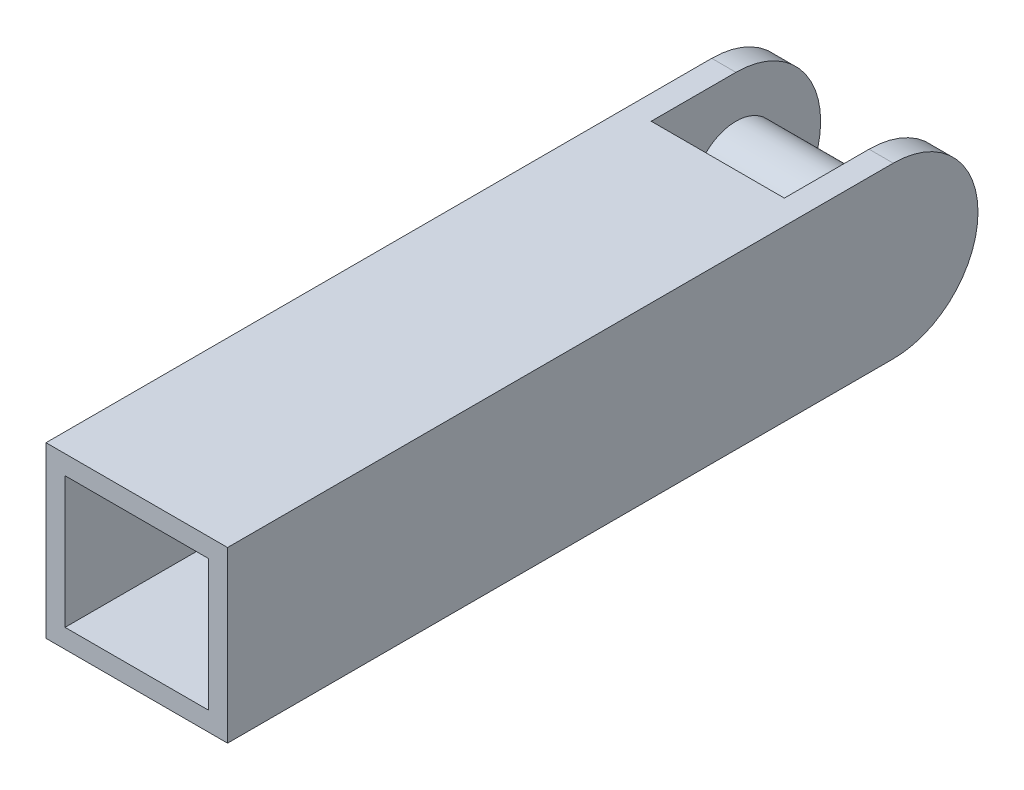
ISO-10303-21;
HEADER;
FILE_DESCRIPTION(('STEP AP214'),'2;1');
FILE_NAME('part.step','',(''),(''),'','','');
FILE_SCHEMA(('AUTOMOTIVE_DESIGN { 1 0 10303 214 1 1 1 1 }'));
ENDSEC;
DATA;
#1=APPLICATION_CONTEXT('core data for automotive mechanical design processes');
#2=APPLICATION_PROTOCOL_DEFINITION('international standard','automotive_design',2000,#1);
#3=PRODUCT_CONTEXT('',#1,'mechanical');
#4=PRODUCT('Part','Part','',(#3));
#5=PRODUCT_RELATED_PRODUCT_CATEGORY('part','',(#4));
#6=PRODUCT_DEFINITION_FORMATION('','',#4);
#7=PRODUCT_DEFINITION_CONTEXT('part definition',#1,'design');
#8=PRODUCT_DEFINITION('design','',#6,#7);
#9=PRODUCT_DEFINITION_SHAPE('','',#8);
#10=(LENGTH_UNIT() NAMED_UNIT(*) SI_UNIT(.MILLI.,.METRE.));
#11=(NAMED_UNIT(*) PLANE_ANGLE_UNIT() SI_UNIT($,.RADIAN.));
#12=(NAMED_UNIT(*) SI_UNIT($,.STERADIAN.) SOLID_ANGLE_UNIT());
#13=UNCERTAINTY_MEASURE_WITH_UNIT(LENGTH_MEASURE(1.E-05),#10,'distance_accuracy_value','');
#14=(GEOMETRIC_REPRESENTATION_CONTEXT(3) GLOBAL_UNCERTAINTY_ASSIGNED_CONTEXT((#13)) GLOBAL_UNIT_ASSIGNED_CONTEXT((#10,
#11,#12)) REPRESENTATION_CONTEXT('',''));
#15=CARTESIAN_POINT('',(0.,0.,0.));
#16=DIRECTION('',(0.,0.,1.));
#17=DIRECTION('',(1.,0.,0.));
#18=AXIS2_PLACEMENT_3D('',#15,#16,#17);
#19=CARTESIAN_POINT('',(34.925,0.,0.));
#20=DIRECTION('',(-1.,0.,0.));
#21=DIRECTION('',(0.,0.,1.));
#22=AXIS2_PLACEMENT_3D('',#19,#20,#21);
#23=CYLINDRICAL_SURFACE('',#22,22.225);
#24=CARTESIAN_POINT('',(34.925,0.,0.));
#25=DIRECTION('',(1.,0.,0.));
#26=DIRECTION('',(0.,0.,-1.));
#27=AXIS2_PLACEMENT_3D('',#24,#25,#26);
#28=CIRCLE('',#27,22.225);
#29=CARTESIAN_POINT('',(34.925,0.,-22.225));
#30=VERTEX_POINT('',#29);
#31=EDGE_CURVE('E11',#30,#30,#28,.T.);
#32=ORIENTED_EDGE('',*,*,#31,.F.);
#33=EDGE_LOOP('',(#32));
#34=FACE_BOUND('',#33,.T.);
#35=CARTESIAN_POINT('',(-34.925,0.,0.));
#36=DIRECTION('',(1.,0.,0.));
#37=DIRECTION('',(0.,0.,-1.));
#38=AXIS2_PLACEMENT_3D('',#35,#36,#37);
#39=CIRCLE('',#38,22.225);
#40=CARTESIAN_POINT('',(-34.925,0.,-22.225));
#41=VERTEX_POINT('',#40);
#42=EDGE_CURVE('E50',#41,#41,#39,.T.);
#43=ORIENTED_EDGE('',*,*,#42,.T.);
#44=EDGE_LOOP('',(#43));
#45=FACE_BOUND('',#44,.T.);
#46=ADVANCED_FACE('F42',(#34,#45),#23,.T.);
#47=CARTESIAN_POINT('',(-47.625,44.45,0.));
#48=DIRECTION('',(0.,1.,0.));
#49=DIRECTION('',(0.,0.,1.));
#50=AXIS2_PLACEMENT_3D('',#47,#48,#49);
#51=PLANE('',#50);
#52=DIRECTION('',(0.,0.,1.));
#53=VECTOR('',#52,1.);
#54=CARTESIAN_POINT('',(-34.925,44.45,0.));
#55=LINE('',#54,#53);
#56=CARTESIAN_POINT('',(-34.925,44.45,0.));
#57=VERTEX_POINT('',#56);
#58=CARTESIAN_POINT('',(-34.925,44.45,44.45));
#59=VERTEX_POINT('',#58);
#60=EDGE_CURVE('E91',#57,#59,#55,.T.);
#61=ORIENTED_EDGE('',*,*,#60,.F.);
#62=DIRECTION('',(1.,0.,0.));
#63=VECTOR('',#62,1.);
#64=CARTESIAN_POINT('',(-47.625,44.45,0.));
#65=LINE('',#64,#63);
#66=CARTESIAN_POINT('',(-47.625,44.45,0.));
#67=VERTEX_POINT('',#66);
#68=EDGE_CURVE('E70',#67,#57,#65,.T.);
#69=ORIENTED_EDGE('',*,*,#68,.F.);
#70=DIRECTION('',(0.,0.,1.));
#71=VECTOR('',#70,1.);
#72=CARTESIAN_POINT('',(-47.625,44.45,0.));
#73=LINE('',#72,#71);
#74=CARTESIAN_POINT('',(-47.625,44.45,349.25));
#75=VERTEX_POINT('',#74);
#76=EDGE_CURVE('E109',#67,#75,#73,.T.);
#77=ORIENTED_EDGE('',*,*,#76,.T.);
#78=DIRECTION('',(1.,0.,0.));
#79=VECTOR('',#78,1.);
#80=CARTESIAN_POINT('',(-365.125,44.45,349.25));
#81=LINE('',#80,#79);
#82=CARTESIAN_POINT('',(47.625,44.45,349.25));
#83=VERTEX_POINT('',#82);
#84=EDGE_CURVE('E245',#75,#83,#81,.T.);
#85=ORIENTED_EDGE('',*,*,#84,.T.);
#86=DIRECTION('',(0.,0.,1.));
#87=VECTOR('',#86,1.);
#88=CARTESIAN_POINT('',(47.625,44.45,0.));
#89=LINE('',#88,#87);
#90=CARTESIAN_POINT('',(47.625,44.45,0.));
#91=VERTEX_POINT('',#90);
#92=EDGE_CURVE('E223',#91,#83,#89,.T.);
#93=ORIENTED_EDGE('',*,*,#92,.F.);
#94=DIRECTION('',(-1.,0.,0.));
#95=VECTOR('',#94,1.);
#96=CARTESIAN_POINT('',(47.625,44.45,0.));
#97=LINE('',#96,#95);
#98=CARTESIAN_POINT('',(34.925,44.45,0.));
#99=VERTEX_POINT('',#98);
#100=EDGE_CURVE('E234',#91,#99,#97,.T.);
#101=ORIENTED_EDGE('',*,*,#100,.T.);
#102=DIRECTION('',(0.,0.,1.));
#103=VECTOR('',#102,1.);
#104=CARTESIAN_POINT('',(34.925,44.45,0.));
#105=LINE('',#104,#103);
#106=CARTESIAN_POINT('',(34.925,44.45,44.45));
#107=VERTEX_POINT('',#106);
#108=EDGE_CURVE('E222',#99,#107,#105,.T.);
#109=ORIENTED_EDGE('',*,*,#108,.T.);
#110=DIRECTION('',(1.,0.,0.));
#111=VECTOR('',#110,1.);
#112=CARTESIAN_POINT('',(-365.125,44.45,44.45));
#113=LINE('',#112,#111);
#114=EDGE_CURVE('E101',#59,#107,#113,.T.);
#115=ORIENTED_EDGE('',*,*,#114,.F.);
#116=EDGE_LOOP('',(#61,#69,#77,#85,#93,#101,#109,#115));
#117=FACE_BOUND('',#116,.T.);
#118=ADVANCED_FACE('F99',(#117),#51,.T.);
#119=CARTESIAN_POINT('',(-47.625,0.,0.));
#120=DIRECTION('',(1.,0.,0.));
#121=DIRECTION('',(0.,0.,-1.));
#122=AXIS2_PLACEMENT_3D('',#119,#120,#121);
#123=CYLINDRICAL_SURFACE('',#122,44.45);
#124=CARTESIAN_POINT('',(-34.925,0.,0.));
#125=DIRECTION('',(1.,0.,0.));
#126=DIRECTION('',(0.,0.,-1.));
#127=AXIS2_PLACEMENT_3D('',#124,#125,#126);
#128=CIRCLE('',#127,44.45);
#129=CARTESIAN_POINT('',(-34.925,-44.45,0.));
#130=VERTEX_POINT('',#129);
#131=EDGE_CURVE('E81',#130,#57,#128,.T.);
#132=ORIENTED_EDGE('',*,*,#131,.F.);
#133=DIRECTION('',(1.,0.,0.));
#134=VECTOR('',#133,1.);
#135=CARTESIAN_POINT('',(-47.625,-44.45,0.));
#136=LINE('',#135,#134);
#137=CARTESIAN_POINT('',(-47.625,-44.45,0.));
#138=VERTEX_POINT('',#137);
#139=EDGE_CURVE('E90',#138,#130,#136,.T.);
#140=ORIENTED_EDGE('',*,*,#139,.F.);
#141=CARTESIAN_POINT('',(-47.625,0.,0.));
#142=DIRECTION('',(1.,0.,0.));
#143=DIRECTION('',(0.,0.,-1.));
#144=AXIS2_PLACEMENT_3D('',#141,#142,#143);
#145=CIRCLE('',#144,44.45);
#146=EDGE_CURVE('E89',#138,#67,#145,.T.);
#147=ORIENTED_EDGE('',*,*,#146,.T.);
#148=ORIENTED_EDGE('',*,*,#68,.T.);
#149=EDGE_LOOP('',(#132,#140,#147,#148));
#150=FACE_BOUND('',#149,.T.);
#151=ADVANCED_FACE('F84',(#150),#123,.T.);
#152=CARTESIAN_POINT('',(-47.625,-44.45,0.));
#153=DIRECTION('',(0.,1.,0.));
#154=DIRECTION('',(0.,0.,1.));
#155=AXIS2_PLACEMENT_3D('',#152,#153,#154);
#156=PLANE('',#155);
#157=DIRECTION('',(0.,0.,1.));
#158=VECTOR('',#157,1.);
#159=CARTESIAN_POINT('',(-34.925,-44.45,0.));
#160=LINE('',#159,#158);
#161=CARTESIAN_POINT('',(-34.925,-44.45,44.45));
#162=VERTEX_POINT('',#161);
#163=EDGE_CURVE('E97',#130,#162,#160,.T.);
#164=ORIENTED_EDGE('',*,*,#163,.T.);
#165=DIRECTION('',(1.,0.,0.));
#166=VECTOR('',#165,1.);
#167=CARTESIAN_POINT('',(-365.125,-44.45,44.45));
#168=LINE('',#167,#166);
#169=CARTESIAN_POINT('',(34.925,-44.45,44.45));
#170=VERTEX_POINT('',#169);
#171=EDGE_CURVE('E123',#162,#170,#168,.T.);
#172=ORIENTED_EDGE('',*,*,#171,.T.);
#173=DIRECTION('',(0.,0.,1.));
#174=VECTOR('',#173,1.);
#175=CARTESIAN_POINT('',(34.925,-44.45,0.));
#176=LINE('',#175,#174);
#177=CARTESIAN_POINT('',(34.925,-44.45,0.));
#178=VERTEX_POINT('',#177);
#179=EDGE_CURVE('E226',#178,#170,#176,.T.);
#180=ORIENTED_EDGE('',*,*,#179,.F.);
#181=DIRECTION('',(-1.,0.,0.));
#182=VECTOR('',#181,1.);
#183=CARTESIAN_POINT('',(47.625,-44.45,0.));
#184=LINE('',#183,#182);
#185=CARTESIAN_POINT('',(47.625,-44.45,0.));
#186=VERTEX_POINT('',#185);
#187=EDGE_CURVE('E228',#186,#178,#184,.T.);
#188=ORIENTED_EDGE('',*,*,#187,.F.);
#189=DIRECTION('',(0.,0.,1.));
#190=VECTOR('',#189,1.);
#191=CARTESIAN_POINT('',(47.625,-44.45,0.));
#192=LINE('',#191,#190);
#193=CARTESIAN_POINT('',(47.625,-44.45,349.25));
#194=VERTEX_POINT('',#193);
#195=EDGE_CURVE('E216',#186,#194,#192,.T.);
#196=ORIENTED_EDGE('',*,*,#195,.T.);
#197=DIRECTION('',(1.,0.,0.));
#198=VECTOR('',#197,1.);
#199=CARTESIAN_POINT('',(-365.125,-44.45,349.25));
#200=LINE('',#199,#198);
#201=CARTESIAN_POINT('',(-47.625,-44.45,349.25));
#202=VERTEX_POINT('',#201);
#203=EDGE_CURVE('E240',#202,#194,#200,.T.);
#204=ORIENTED_EDGE('',*,*,#203,.F.);
#205=DIRECTION('',(0.,0.,1.));
#206=VECTOR('',#205,1.);
#207=CARTESIAN_POINT('',(-47.625,-44.45,0.));
#208=LINE('',#207,#206);
#209=EDGE_CURVE('E104',#138,#202,#208,.T.);
#210=ORIENTED_EDGE('',*,*,#209,.F.);
#211=ORIENTED_EDGE('',*,*,#139,.T.);
#212=EDGE_LOOP('',(#164,#172,#180,#188,#196,#204,#210,#211));
#213=FACE_BOUND('',#212,.T.);
#214=ADVANCED_FACE('F125',(#213),#156,.F.);
#215=CARTESIAN_POINT('',(-47.625,0.,0.));
#216=DIRECTION('',(1.,0.,0.));
#217=DIRECTION('',(0.,0.,-1.));
#218=AXIS2_PLACEMENT_3D('',#215,#216,#217);
#219=PLANE('',#218);
#220=ORIENTED_EDGE('',*,*,#209,.T.);
#221=DIRECTION('',(0.,-1.,0.));
#222=VECTOR('',#221,1.);
#223=CARTESIAN_POINT('',(-47.625,0.,349.25));
#224=LINE('',#223,#222);
#225=EDGE_CURVE('E119',#75,#202,#224,.T.);
#226=ORIENTED_EDGE('',*,*,#225,.F.);
#227=ORIENTED_EDGE('',*,*,#76,.F.);
#228=ORIENTED_EDGE('',*,*,#146,.F.);
#229=EDGE_LOOP('',(#220,#226,#227,#228));
#230=FACE_BOUND('',#229,.T.);
#231=ADVANCED_FACE('F288',(#230),#219,.F.);
#232=CARTESIAN_POINT('',(-34.925,0.,0.));
#233=DIRECTION('',(1.,0.,0.));
#234=DIRECTION('',(0.,0.,-1.));
#235=AXIS2_PLACEMENT_3D('',#232,#233,#234);
#236=PLANE('',#235);
#237=ORIENTED_EDGE('',*,*,#42,.F.);
#238=EDGE_LOOP('',(#237));
#239=FACE_BOUND('',#238,.T.);
#240=DIRECTION('',(0.,-1.,0.));
#241=VECTOR('',#240,1.);
#242=CARTESIAN_POINT('',(-34.925,0.,44.45));
#243=LINE('',#242,#241);
#244=EDGE_CURVE('E118',#59,#162,#243,.T.);
#245=ORIENTED_EDGE('',*,*,#244,.T.);
#246=ORIENTED_EDGE('',*,*,#163,.F.);
#247=ORIENTED_EDGE('',*,*,#131,.T.);
#248=ORIENTED_EDGE('',*,*,#60,.T.);
#249=EDGE_LOOP('',(#245,#246,#247,#248));
#250=FACE_BOUND('',#249,.T.);
#251=ADVANCED_FACE('F94',(#239,#250),#236,.T.);
#252=CARTESIAN_POINT('',(-365.125,0.,44.45));
#253=DIRECTION('',(0.,0.,1.));
#254=DIRECTION('',(0.,-1.,0.));
#255=AXIS2_PLACEMENT_3D('',#252,#253,#254);
#256=PLANE('',#255);
#257=ORIENTED_EDGE('',*,*,#244,.F.);
#258=ORIENTED_EDGE('',*,*,#114,.T.);
#259=DIRECTION('',(0.,-1.,0.));
#260=VECTOR('',#259,1.);
#261=CARTESIAN_POINT('',(34.925,0.,44.45));
#262=LINE('',#261,#260);
#263=EDGE_CURVE('E219',#107,#170,#262,.T.);
#264=ORIENTED_EDGE('',*,*,#263,.T.);
#265=ORIENTED_EDGE('',*,*,#171,.F.);
#266=EDGE_LOOP('',(#257,#258,#264,#265));
#267=FACE_BOUND('',#266,.T.);
#268=ADVANCED_FACE('F126',(#267),#256,.F.);
#269=CARTESIAN_POINT('',(-365.125,0.,349.25));
#270=DIRECTION('',(0.,0.,-1.));
#271=DIRECTION('',(-1.,0.,0.));
#272=AXIS2_PLACEMENT_3D('',#269,#270,#271);
#273=PLANE('',#272);
#274=DIRECTION('',(-1.,0.,0.));
#275=VECTOR('',#274,1.);
#276=CARTESIAN_POINT('',(37.625,34.45,349.25));
#277=LINE('',#276,#275);
#278=CARTESIAN_POINT('',(37.6250000000001,34.45,349.25));
#279=VERTEX_POINT('',#278);
#280=CARTESIAN_POINT('',(-37.625,34.45,349.25));
#281=VERTEX_POINT('',#280);
#282=EDGE_CURVE('E202',#279,#281,#277,.T.);
#283=ORIENTED_EDGE('',*,*,#282,.F.);
#284=DIRECTION('',(0.,1.,0.));
#285=VECTOR('',#284,1.);
#286=CARTESIAN_POINT('',(37.625,-34.45,349.25));
#287=LINE('',#286,#285);
#288=CARTESIAN_POINT('',(37.625,-34.45,349.25));
#289=VERTEX_POINT('',#288);
#290=EDGE_CURVE('E59',#289,#279,#287,.T.);
#291=ORIENTED_EDGE('',*,*,#290,.F.);
#292=DIRECTION('',(1.,0.,0.));
#293=VECTOR('',#292,1.);
#294=CARTESIAN_POINT('',(-37.625,-34.45,349.25));
#295=LINE('',#294,#293);
#296=CARTESIAN_POINT('',(-37.625,-34.45,349.25));
#297=VERTEX_POINT('',#296);
#298=EDGE_CURVE('E193',#297,#289,#295,.T.);
#299=ORIENTED_EDGE('',*,*,#298,.F.);
#300=DIRECTION('',(0.,-1.,0.));
#301=VECTOR('',#300,1.);
#302=CARTESIAN_POINT('',(-37.625,34.45,349.25));
#303=LINE('',#302,#301);
#304=EDGE_CURVE('E197',#281,#297,#303,.T.);
#305=ORIENTED_EDGE('',*,*,#304,.F.);
#306=EDGE_LOOP('',(#283,#291,#299,#305));
#307=FACE_BOUND('',#306,.T.);
#308=ORIENTED_EDGE('',*,*,#84,.F.);
#309=ORIENTED_EDGE('',*,*,#225,.T.);
#310=ORIENTED_EDGE('',*,*,#203,.T.);
#311=DIRECTION('',(0.,-1.,0.));
#312=VECTOR('',#311,1.);
#313=CARTESIAN_POINT('',(47.625,0.,349.25));
#314=LINE('',#313,#312);
#315=EDGE_CURVE('E208',#83,#194,#314,.T.);
#316=ORIENTED_EDGE('',*,*,#315,.F.);
#317=EDGE_LOOP('',(#308,#309,#310,#316));
#318=FACE_BOUND('',#317,.T.);
#319=ADVANCED_FACE('F249',(#307,#318),#273,.F.);
#320=CARTESIAN_POINT('',(47.625,0.,0.));
#321=DIRECTION('',(-1.,0.,0.));
#322=DIRECTION('',(0.,0.,-1.));
#323=AXIS2_PLACEMENT_3D('',#320,#321,#322);
#324=CYLINDRICAL_SURFACE('',#323,44.45);
#325=CARTESIAN_POINT('',(34.925,0.,0.));
#326=DIRECTION('',(1.,0.,0.));
#327=DIRECTION('',(0.,0.,-1.));
#328=AXIS2_PLACEMENT_3D('',#325,#326,#327);
#329=CIRCLE('',#328,44.45);
#330=EDGE_CURVE('E233',#178,#99,#329,.T.);
#331=ORIENTED_EDGE('',*,*,#330,.T.);
#332=ORIENTED_EDGE('',*,*,#100,.F.);
#333=CARTESIAN_POINT('',(47.625,0.,0.));
#334=DIRECTION('',(1.,0.,0.));
#335=DIRECTION('',(0.,0.,-1.));
#336=AXIS2_PLACEMENT_3D('',#333,#334,#335);
#337=CIRCLE('',#336,44.45);
#338=EDGE_CURVE('E217',#186,#91,#337,.T.);
#339=ORIENTED_EDGE('',*,*,#338,.F.);
#340=ORIENTED_EDGE('',*,*,#187,.T.);
#341=EDGE_LOOP('',(#331,#332,#339,#340));
#342=FACE_BOUND('',#341,.T.);
#343=ADVANCED_FACE('F256',(#342),#324,.T.);
#344=CARTESIAN_POINT('',(47.625,0.,0.));
#345=DIRECTION('',(-1.,0.,0.));
#346=DIRECTION('',(0.,0.,-1.));
#347=AXIS2_PLACEMENT_3D('',#344,#345,#346);
#348=PLANE('',#347);
#349=ORIENTED_EDGE('',*,*,#195,.F.);
#350=ORIENTED_EDGE('',*,*,#338,.T.);
#351=ORIENTED_EDGE('',*,*,#92,.T.);
#352=ORIENTED_EDGE('',*,*,#315,.T.);
#353=EDGE_LOOP('',(#349,#350,#351,#352));
#354=FACE_BOUND('',#353,.T.);
#355=ADVANCED_FACE('F255',(#354),#348,.F.);
#356=CARTESIAN_POINT('',(34.925,0.,0.));
#357=DIRECTION('',(-1.,0.,0.));
#358=DIRECTION('',(0.,0.,-1.));
#359=AXIS2_PLACEMENT_3D('',#356,#357,#358);
#360=PLANE('',#359);
#361=ORIENTED_EDGE('',*,*,#31,.T.);
#362=EDGE_LOOP('',(#361));
#363=FACE_BOUND('',#362,.T.);
#364=ORIENTED_EDGE('',*,*,#263,.F.);
#365=ORIENTED_EDGE('',*,*,#108,.F.);
#366=ORIENTED_EDGE('',*,*,#330,.F.);
#367=ORIENTED_EDGE('',*,*,#179,.T.);
#368=EDGE_LOOP('',(#364,#365,#366,#367));
#369=FACE_BOUND('',#368,.T.);
#370=ADVANCED_FACE('F265',(#363,#369),#360,.T.);
#371=CARTESIAN_POINT('',(37.625,-34.45,199.39));
#372=DIRECTION('',(1.,0.,0.));
#373=DIRECTION('',(0.,0.,-1.));
#374=AXIS2_PLACEMENT_3D('',#371,#372,#373);
#375=PLANE('',#374);
#376=ORIENTED_EDGE('',*,*,#290,.T.);
#377=DIRECTION('',(0.,0.,1.));
#378=VECTOR('',#377,1.);
#379=CARTESIAN_POINT('',(37.625,34.45,199.39));
#380=LINE('',#379,#378);
#381=CARTESIAN_POINT('',(37.625,34.45,199.39));
#382=VERTEX_POINT('',#381);
#383=EDGE_CURVE('E173',#382,#279,#380,.T.);
#384=ORIENTED_EDGE('',*,*,#383,.F.);
#385=DIRECTION('',(0.,1.,0.));
#386=VECTOR('',#385,1.);
#387=CARTESIAN_POINT('',(37.625,-34.45,199.39));
#388=LINE('',#387,#386);
#389=CARTESIAN_POINT('',(37.625,-34.45,199.39));
#390=VERTEX_POINT('',#389);
#391=EDGE_CURVE('E180',#390,#382,#388,.T.);
#392=ORIENTED_EDGE('',*,*,#391,.F.);
#393=DIRECTION('',(0.,0.,1.));
#394=VECTOR('',#393,1.);
#395=CARTESIAN_POINT('',(37.625,-34.45,199.39));
#396=LINE('',#395,#394);
#397=EDGE_CURVE('E206',#390,#289,#396,.T.);
#398=ORIENTED_EDGE('',*,*,#397,.T.);
#399=EDGE_LOOP('',(#376,#384,#392,#398));
#400=FACE_BOUND('',#399,.T.);
#401=ADVANCED_FACE('F174',(#400),#375,.F.);
#402=CARTESIAN_POINT('',(-37.625,-34.45,199.39));
#403=DIRECTION('',(0.,-1.,0.));
#404=DIRECTION('',(0.,0.,-1.));
#405=AXIS2_PLACEMENT_3D('',#402,#403,#404);
#406=PLANE('',#405);
#407=ORIENTED_EDGE('',*,*,#298,.T.);
#408=ORIENTED_EDGE('',*,*,#397,.F.);
#409=DIRECTION('',(1.,0.,0.));
#410=VECTOR('',#409,1.);
#411=CARTESIAN_POINT('',(-37.625,-34.45,199.39));
#412=LINE('',#411,#410);
#413=CARTESIAN_POINT('',(-37.625,-34.45,199.39));
#414=VERTEX_POINT('',#413);
#415=EDGE_CURVE('E182',#414,#390,#412,.T.);
#416=ORIENTED_EDGE('',*,*,#415,.F.);
#417=DIRECTION('',(0.,0.,1.));
#418=VECTOR('',#417,1.);
#419=CARTESIAN_POINT('',(-37.625,-34.45,199.39));
#420=LINE('',#419,#418);
#421=EDGE_CURVE('E212',#414,#297,#420,.T.);
#422=ORIENTED_EDGE('',*,*,#421,.T.);
#423=EDGE_LOOP('',(#407,#408,#416,#422));
#424=FACE_BOUND('',#423,.T.);
#425=ADVANCED_FACE('F272',(#424),#406,.F.);
#426=CARTESIAN_POINT('',(-37.625,34.45,199.39));
#427=DIRECTION('',(-1.,0.,0.));
#428=DIRECTION('',(0.,0.,1.));
#429=AXIS2_PLACEMENT_3D('',#426,#427,#428);
#430=PLANE('',#429);
#431=ORIENTED_EDGE('',*,*,#304,.T.);
#432=ORIENTED_EDGE('',*,*,#421,.F.);
#433=DIRECTION('',(0.,-1.,0.));
#434=VECTOR('',#433,1.);
#435=CARTESIAN_POINT('',(-37.625,34.45,199.39));
#436=LINE('',#435,#434);
#437=CARTESIAN_POINT('',(-37.625,34.45,199.39));
#438=VERTEX_POINT('',#437);
#439=EDGE_CURVE('E192',#438,#414,#436,.T.);
#440=ORIENTED_EDGE('',*,*,#439,.F.);
#441=DIRECTION('',(0.,0.,1.));
#442=VECTOR('',#441,1.);
#443=CARTESIAN_POINT('',(-37.625,34.45,199.39));
#444=LINE('',#443,#442);
#445=EDGE_CURVE('E185',#438,#281,#444,.T.);
#446=ORIENTED_EDGE('',*,*,#445,.T.);
#447=EDGE_LOOP('',(#431,#432,#440,#446));
#448=FACE_BOUND('',#447,.T.);
#449=ADVANCED_FACE('F343',(#448),#430,.F.);
#450=CARTESIAN_POINT('',(37.625,34.45,199.39));
#451=DIRECTION('',(0.,1.,0.));
#452=DIRECTION('',(0.,0.,1.));
#453=AXIS2_PLACEMENT_3D('',#450,#451,#452);
#454=PLANE('',#453);
#455=ORIENTED_EDGE('',*,*,#282,.T.);
#456=ORIENTED_EDGE('',*,*,#445,.F.);
#457=DIRECTION('',(-1.,0.,0.));
#458=VECTOR('',#457,1.);
#459=CARTESIAN_POINT('',(37.625,34.45,199.39));
#460=LINE('',#459,#458);
#461=EDGE_CURVE('E187',#382,#438,#460,.T.);
#462=ORIENTED_EDGE('',*,*,#461,.F.);
#463=ORIENTED_EDGE('',*,*,#383,.T.);
#464=EDGE_LOOP('',(#455,#456,#462,#463));
#465=FACE_BOUND('',#464,.T.);
#466=ADVANCED_FACE('F190',(#465),#454,.F.);
#467=CARTESIAN_POINT('',(0.,0.,199.39));
#468=DIRECTION('',(0.,0.,1.));
#469=DIRECTION('',(1.,0.,0.));
#470=AXIS2_PLACEMENT_3D('',#467,#468,#469);
#471=PLANE('',#470);
#472=ORIENTED_EDGE('',*,*,#391,.T.);
#473=ORIENTED_EDGE('',*,*,#461,.T.);
#474=ORIENTED_EDGE('',*,*,#439,.T.);
#475=ORIENTED_EDGE('',*,*,#415,.T.);
#476=EDGE_LOOP('',(#472,#473,#474,#475));
#477=FACE_BOUND('',#476,.T.);
#478=ADVANCED_FACE('F194',(#477),#471,.T.);
#479=CLOSED_SHELL('',(#46,#118,#151,#214,#231,#251,#268,#319,#343,#355,#370,#401,#425,#449,#466,#478));
#480=MANIFOLD_SOLID_BREP('B2',#479);
#481=ADVANCED_BREP_SHAPE_REPRESENTATION('',(#18,#480),#14);
#482=SHAPE_DEFINITION_REPRESENTATION(#9,#481);
ENDSEC;
END-ISO-10303-21;
